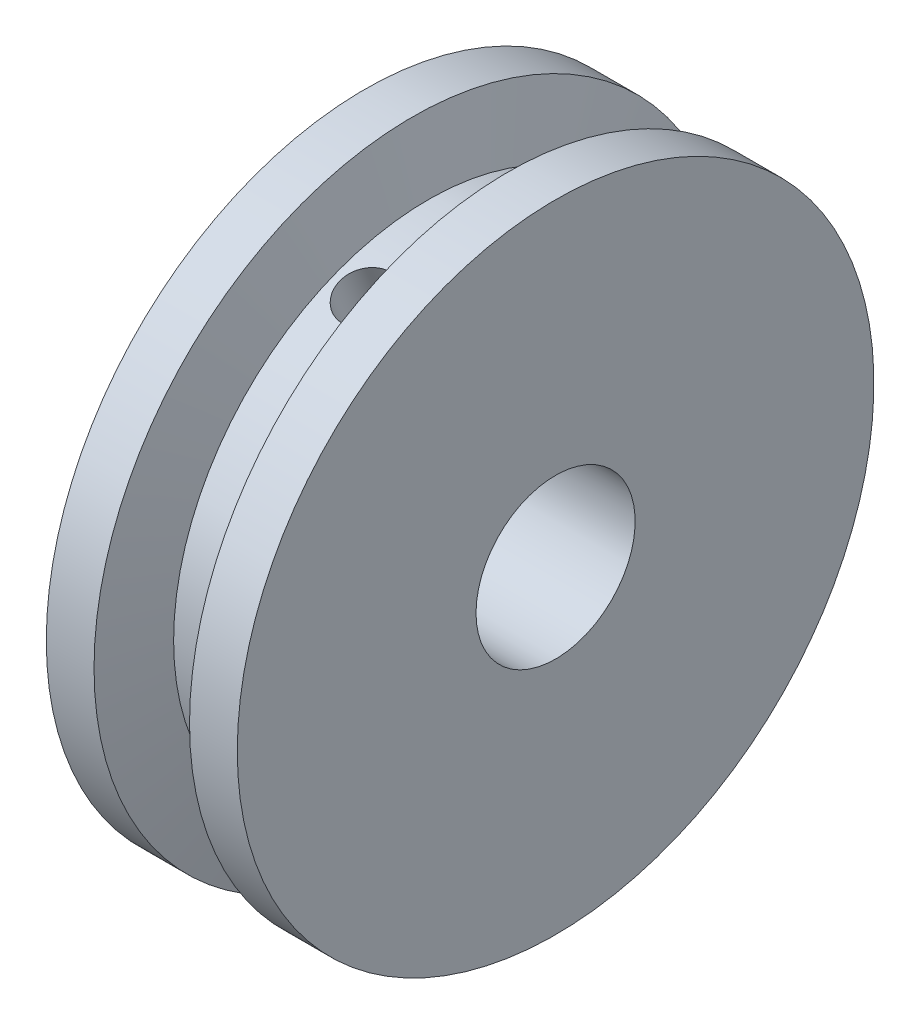
ISO-10303-21;
HEADER;
FILE_DESCRIPTION(('STEP AP214'),'2;1');
FILE_NAME('part.step','',(''),(''),'','','');
FILE_SCHEMA(('AUTOMOTIVE_DESIGN { 1 0 10303 214 1 1 1 1 }'));
ENDSEC;
DATA;
#1=APPLICATION_CONTEXT('core data for automotive mechanical design processes');
#2=APPLICATION_PROTOCOL_DEFINITION('international standard','automotive_design',2000,#1);
#3=PRODUCT_CONTEXT('',#1,'mechanical');
#4=PRODUCT('Part','Part','',(#3));
#5=PRODUCT_RELATED_PRODUCT_CATEGORY('part','',(#4));
#6=PRODUCT_DEFINITION_FORMATION('','',#4);
#7=PRODUCT_DEFINITION_CONTEXT('part definition',#1,'design');
#8=PRODUCT_DEFINITION('design','',#6,#7);
#9=PRODUCT_DEFINITION_SHAPE('','',#8);
#10=(LENGTH_UNIT() NAMED_UNIT(*) SI_UNIT(.MILLI.,.METRE.));
#11=(NAMED_UNIT(*) PLANE_ANGLE_UNIT() SI_UNIT($,.RADIAN.));
#12=(NAMED_UNIT(*) SI_UNIT($,.STERADIAN.) SOLID_ANGLE_UNIT());
#13=UNCERTAINTY_MEASURE_WITH_UNIT(LENGTH_MEASURE(1.E-05),#10,'distance_accuracy_value','');
#14=(GEOMETRIC_REPRESENTATION_CONTEXT(3) GLOBAL_UNCERTAINTY_ASSIGNED_CONTEXT((#13)) GLOBAL_UNIT_ASSIGNED_CONTEXT((#10,
#11,#12)) REPRESENTATION_CONTEXT('',''));
#15=CARTESIAN_POINT('',(0.,0.,0.));
#16=DIRECTION('',(0.,0.,1.));
#17=DIRECTION('',(1.,0.,0.));
#18=AXIS2_PLACEMENT_3D('',#15,#16,#17);
#19=CARTESIAN_POINT('',(-6.,5.74096746363637,0.));
#20=DIRECTION('',(1.,0.,0.));
#21=DIRECTION('',(0.,0.,-1.));
#22=AXIS2_PLACEMENT_3D('',#19,#20,#21);
#23=PLANE('',#22);
#24=CARTESIAN_POINT('',(-6.,-14.2590325363636,0.));
#25=DIRECTION('',(-1.,0.,0.));
#26=DIRECTION('',(0.,0.,1.));
#27=AXIS2_PLACEMENT_3D('',#24,#25,#26);
#28=CIRCLE('',#27,5.);
#29=CARTESIAN_POINT('',(-6.,-14.2590325363636,5.));
#30=VERTEX_POINT('',#29);
#31=EDGE_CURVE('E69',#30,#30,#28,.T.);
#32=ORIENTED_EDGE('',*,*,#31,.F.);
#33=EDGE_LOOP('',(#32));
#34=FACE_BOUND('',#33,.T.);
#35=CARTESIAN_POINT('',(-6.,-14.2590325363636,0.));
#36=DIRECTION('',(-1.,0.,0.));
#37=DIRECTION('',(0.,0.,1.));
#38=AXIS2_PLACEMENT_3D('',#35,#36,#37);
#39=CIRCLE('',#38,20.);
#40=CARTESIAN_POINT('',(-6.,-14.2590325363636,20.));
#41=VERTEX_POINT('',#40);
#42=EDGE_CURVE('E44',#41,#41,#39,.T.);
#43=ORIENTED_EDGE('',*,*,#42,.T.);
#44=EDGE_LOOP('',(#43));
#45=FACE_BOUND('',#44,.T.);
#46=ADVANCED_FACE('F34',(#34,#45),#23,.F.);
#47=CARTESIAN_POINT('',(-24.2895145671609,-14.2590325363636,0.));
#48=DIRECTION('',(-1.,0.,0.));
#49=DIRECTION('',(0.,0.,1.));
#50=AXIS2_PLACEMENT_3D('',#47,#48,#49);
#51=CYLINDRICAL_SURFACE('',#50,20.);
#52=ORIENTED_EDGE('',*,*,#42,.F.);
#53=EDGE_LOOP('',(#52));
#54=FACE_BOUND('',#53,.T.);
#55=CARTESIAN_POINT('',(-3.,-14.2590325363636,0.));
#56=DIRECTION('',(-1.,0.,0.));
#57=DIRECTION('',(0.,0.,1.));
#58=AXIS2_PLACEMENT_3D('',#55,#56,#57);
#59=CIRCLE('',#58,20.);
#60=CARTESIAN_POINT('',(-3.,-14.2590325363636,20.));
#61=VERTEX_POINT('',#60);
#62=EDGE_CURVE('E48',#61,#61,#59,.T.);
#63=ORIENTED_EDGE('',*,*,#62,.T.);
#64=EDGE_LOOP('',(#63));
#65=FACE_BOUND('',#64,.T.);
#66=ADVANCED_FACE('F92',(#54,#65),#51,.T.);
#67=CARTESIAN_POINT('',(-2.,-14.2590325363636,0.));
#68=DIRECTION('',(-1.,0.,0.));
#69=DIRECTION('',(0.,0.,1.));
#70=AXIS2_PLACEMENT_3D('',#67,#68,#69);
#71=CONICAL_SURFACE('',#70,16.,1.32581766366803);
#72=ORIENTED_EDGE('',*,*,#62,.F.);
#73=EDGE_LOOP('',(#72));
#74=FACE_BOUND('',#73,.T.);
#75=CARTESIAN_POINT('',(-2.,-14.2590325363636,0.));
#76=DIRECTION('',(-1.,0.,0.));
#77=DIRECTION('',(0.,0.,1.));
#78=AXIS2_PLACEMENT_3D('',#75,#76,#77);
#79=CIRCLE('',#78,16.);
#80=CARTESIAN_POINT('',(-2.,-14.2590325363636,16.));
#81=VERTEX_POINT('',#80);
#82=EDGE_CURVE('E52',#81,#81,#79,.T.);
#83=ORIENTED_EDGE('',*,*,#82,.T.);
#84=EDGE_LOOP('',(#83));
#85=FACE_BOUND('',#84,.T.);
#86=ADVANCED_FACE('F97',(#74,#85),#71,.T.);
#87=CARTESIAN_POINT('',(-24.2895145671609,-14.2590325363636,0.));
#88=DIRECTION('',(-1.,0.,0.));
#89=DIRECTION('',(0.,0.,1.));
#90=AXIS2_PLACEMENT_3D('',#87,#88,#89);
#91=CYLINDRICAL_SURFACE('',#90,16.);
#92=CARTESIAN_POINT('',(0.112968309193007,-0.145561609668122,7.53723678819504));
#93=CARTESIAN_POINT('',(0.0205518535415319,-0.145559068231829,7.53723350949665));
#94=CARTESIAN_POINT('',(-0.0719253311153655,-0.141866476878859,7.53033025097685));
#95=CARTESIAN_POINT('',(-0.25431464428269,-0.127254317295673,7.50287124472542));
#96=CARTESIAN_POINT('',(-0.344223849836857,-0.11632683124865,7.48230053935114));
#97=CARTESIAN_POINT('',(-0.518809586540177,-0.0877519112776121,7.42803742126934));
#98=CARTESIAN_POINT('',(-0.603489295750778,-0.0701086063312701,7.39435307072182));
#99=CARTESIAN_POINT('',(-0.765275494765252,-0.028892772966863,7.3147195986779));
#100=CARTESIAN_POINT('',(-0.842383460883551,-0.00532140358842814,7.26877287458133));
#101=CARTESIAN_POINT('',(-0.987152826625956,0.0468304281512649,7.16558638911541));
#102=CARTESIAN_POINT('',(-1.05478089263204,0.07542780640204,7.10830840597566));
#103=CARTESIAN_POINT('',(-1.17838360162462,0.136397097363451,6.98400942839225));
#104=CARTESIAN_POINT('',(-1.23435770630739,0.168769184322528,6.91698798413478));
#105=CARTESIAN_POINT('',(-1.33317937895686,0.236093311392244,6.77477088238849));
#106=CARTESIAN_POINT('',(-1.37599735867073,0.271050950683508,6.69955730748668));
#107=CARTESIAN_POINT('',(-1.44710202121632,0.342182679237759,6.54307973727256));
#108=CARTESIAN_POINT('',(-1.47538907906339,0.378356737081632,6.461815898168));
#109=CARTESIAN_POINT('',(-1.51653092947151,0.450539684427988,6.29576424819312));
#110=CARTESIAN_POINT('',(-1.52944056022303,0.486548701899837,6.21099008204063));
#111=CARTESIAN_POINT('',(-1.53963080947962,0.55739848866408,6.04002746529667));
#112=CARTESIAN_POINT('',(-1.53691185695116,0.592239289994755,5.95383905358753));
#113=CARTESIAN_POINT('',(-1.51596657234881,0.659649133728099,5.78284995640973));
#114=CARTESIAN_POINT('',(-1.49779920900549,0.692226305897914,5.6980452420747));
#115=CARTESIAN_POINT('',(-1.44656470859894,0.754476868156829,5.53194424669181));
#116=CARTESIAN_POINT('',(-1.41349736750771,0.784150218476616,5.45064801370291));
#117=CARTESIAN_POINT('',(-1.33333713653165,0.840061917567091,5.29379821321813));
#118=CARTESIAN_POINT('',(-1.2862182172953,0.866293760236592,5.2182556327842));
#119=CARTESIAN_POINT('',(-1.17931126720948,0.914854341597349,5.07531911104032));
#120=CARTESIAN_POINT('',(-1.1195228410534,0.937182958462734,5.00792542409049));
#121=CARTESIAN_POINT('',(-0.98864256306585,0.977779758613138,4.88302092750267));
#122=CARTESIAN_POINT('',(-0.917499402911564,0.996028562128745,4.82555756974599));
#123=CARTESIAN_POINT('',(-0.766106855811007,1.02819310620386,4.72267371330727));
#124=CARTESIAN_POINT('',(-0.685857454241717,1.04210883980509,4.67725323396436));
#125=CARTESIAN_POINT('',(-0.518490311119026,1.06554702496577,4.59988086350573));
#126=CARTESIAN_POINT('',(-0.431370984517459,1.07506845916733,4.56793209147579));
#127=CARTESIAN_POINT('',(-0.252756933566807,1.08969181375517,4.51855396322392));
#128=CARTESIAN_POINT('',(-0.161262351273868,1.09479387752725,4.50112413593774));
#129=CARTESIAN_POINT('',(0.0230547297254111,1.100561851296,4.4814023822909));
#130=CARTESIAN_POINT('',(0.115869190446933,1.10124804657818,4.47904123497395));
#131=CARTESIAN_POINT('',(0.300586562233192,1.09823814907038,4.48935015316863));
#132=CARTESIAN_POINT('',(0.392489486392356,1.09454211932427,4.50202000244036));
#133=CARTESIAN_POINT('',(0.572565177039403,1.08278289558658,4.54192976481588));
#134=CARTESIAN_POINT('',(0.660745846846731,1.07472951434396,4.56913693817964));
#135=CARTESIAN_POINT('',(0.831119749395945,1.05427505474403,4.63722620805097));
#136=CARTESIAN_POINT('',(0.913312836510138,1.04187387068373,4.67810863702773));
#137=CARTESIAN_POINT('',(1.06970520770507,1.0127159492053,4.77243488079652));
#138=CARTESIAN_POINT('',(1.14387448243546,0.995943609830261,4.82592362448569));
#139=CARTESIAN_POINT('',(1.28180930793979,0.958173322264363,4.94372958688449));
#140=CARTESIAN_POINT('',(1.34557458458423,0.937175262764757,5.00804709082478));
#141=CARTESIAN_POINT('',(1.46113932464353,0.891074583318936,5.14582758084132));
#142=CARTESIAN_POINT('',(1.51289193873064,0.865956524043532,5.21932470962547));
#143=CARTESIAN_POINT('',(1.60263970119211,0.812028845703938,5.3730564050552));
#144=CARTESIAN_POINT('',(1.64063504842917,0.783219280009007,5.45329087429116));
#145=CARTESIAN_POINT('',(1.7017105743425,0.722499429357018,5.6179514886186));
#146=CARTESIAN_POINT('',(1.72481891084244,0.690595130242929,5.70236939322261));
#147=CARTESIAN_POINT('',(1.75555631982683,0.624368140953718,5.87305370190918));
#148=CARTESIAN_POINT('',(1.76318585692532,0.590045523399217,5.95932005043003));
#149=CARTESIAN_POINT('',(1.76274232064799,0.520067938259847,6.13080140931853));
#150=CARTESIAN_POINT('',(1.75474191982625,0.484419889270978,6.21601944024129));
#151=CARTESIAN_POINT('',(1.72341817204669,0.41271987016398,6.38341406616322));
#152=CARTESIAN_POINT('',(1.70009481520622,0.376667899785354,6.46559065920077));
#153=CARTESIAN_POINT('',(1.63880767023627,0.305366250014375,6.62464254699801));
#154=CARTESIAN_POINT('',(1.60084616641208,0.270116446351147,6.70151866669931));
#155=CARTESIAN_POINT('',(1.51136801303101,0.201678139286264,6.84794763246491));
#156=CARTESIAN_POINT('',(1.45985141511913,0.168489628031666,6.91750050642942));
#157=CARTESIAN_POINT('',(1.34445324567139,0.105298285896461,7.04778508975062));
#158=CARTESIAN_POINT('',(1.28051754523273,0.0753103250390106,7.10847606854158));
#159=CARTESIAN_POINT('',(1.14220379185975,0.0199014692526676,7.21913318552632));
#160=CARTESIAN_POINT('',(1.0678232409156,-0.00551832982093405,7.26909675088162));
#161=CARTESIAN_POINT('',(0.91051088936628,-0.0507600073112511,7.35713638955805));
#162=CARTESIAN_POINT('',(0.827556652052046,-0.0705666630285627,7.39518016563252));
#163=CARTESIAN_POINT('',(0.655665696227961,-0.103588659152114,7.45819588485051));
#164=CARTESIAN_POINT('',(0.56673582609769,-0.116811403620899,7.48318251323042));
#165=CARTESIAN_POINT('',(0.416583942274798,-0.132779481958952,7.51326467420303));
#166=CARTESIAN_POINT('',(0.35632055521419,-0.13756292124429,7.52224319346543));
#167=CARTESIAN_POINT('',(0.2350363792227,-0.143954817287313,7.53423031981174));
#168=CARTESIAN_POINT('',(0.174015593731283,-0.145563288457721,7.53723895399585));
#169=CARTESIAN_POINT('',(0.112968309193007,-0.145561609668122,7.53723678819504));
#170=B_SPLINE_CURVE_WITH_KNOTS('',3,(#92,#93,#94,#95,#96,#97,#98,#99,#100,#101,#102,#103,#104,
#105,#106,#107,#108,#109,#110,#111,#112,#113,#114,#115,#116,#117,#118,#119,#120,#121,#122,#123,
#124,#125,#126,#127,#128,#129,#130,#131,#132,#133,#134,#135,#136,#137,#138,#139,#140,#141,#142,
#143,#144,#145,#146,#147,#148,#149,#150,#151,#152,#153,#154,#155,#156,#157,#158,#159,#160,#161,
#162,#163,#164,#165,#166,#167,#168,#169),.UNSPECIFIED.,.T.,.F.,(4,2,2,2,2,2,2,2,2,2,2,2,2,2,2,2,
2,2,2,2,2,2,2,2,2,2,2,2,2,2,2,2,2,2,2,2,2,2,4),(0.,0.277026424212356,0.554356526401624,
0.831516396918815,1.10862211993513,1.38667900246051,1.66474872575789,1.94343932871641,
2.22212273884121,2.49980931838174,2.77748827613979,3.05411202834668,3.33073956852619,
3.60788275479593,3.88503458960055,4.16347621632117,4.44191829017633,4.72042479598896,
4.99892226536187,5.27613947517468,5.55335269691556,5.82994421763749,6.10654246326806,
6.38414182361553,6.66174849710288,6.94042029643825,7.2190880673831,7.49722719652357,
7.77535797687329,8.0521986449277,8.3290394915325,8.60583715417001,8.88263376222162,
9.1606650195741,9.43876288500742,9.71760788090354,9.99613858410796,10.1791339997544,
10.3621285846938),.UNSPECIFIED.);
#171=CARTESIAN_POINT('',(0.112968309193007,-0.145561609668122,7.53723678819504));
#172=VERTEX_POINT('',#171);
#173=EDGE_CURVE('E10',#172,#172,#170,.T.);
#174=ORIENTED_EDGE('',*,*,#173,.T.);
#175=EDGE_LOOP('',(#174));
#176=FACE_BOUND('',#175,.T.);
#177=ORIENTED_EDGE('',*,*,#82,.F.);
#178=EDGE_LOOP('',(#177));
#179=FACE_BOUND('',#178,.T.);
#180=CARTESIAN_POINT('',(2.,-14.2590325363636,0.));
#181=DIRECTION('',(-1.,0.,0.));
#182=DIRECTION('',(0.,0.,1.));
#183=AXIS2_PLACEMENT_3D('',#180,#181,#182);
#184=CIRCLE('',#183,16.);
#185=CARTESIAN_POINT('',(2.,-14.2590325363636,16.));
#186=VERTEX_POINT('',#185);
#187=EDGE_CURVE('E57',#186,#186,#184,.T.);
#188=ORIENTED_EDGE('',*,*,#187,.T.);
#189=EDGE_LOOP('',(#188));
#190=FACE_BOUND('',#189,.T.);
#191=ADVANCED_FACE('F104',(#176,#179,#190),#91,.T.);
#192=CARTESIAN_POINT('',(3.,-14.2590325363636,0.));
#193=DIRECTION('',(1.,0.,0.));
#194=DIRECTION('',(0.,0.,-1.));
#195=AXIS2_PLACEMENT_3D('',#192,#193,#194);
#196=CONICAL_SURFACE('',#195,20.,1.32581766366803);
#197=ORIENTED_EDGE('',*,*,#187,.F.);
#198=EDGE_LOOP('',(#197));
#199=FACE_BOUND('',#198,.T.);
#200=CARTESIAN_POINT('',(3.,-14.2590325363636,0.));
#201=DIRECTION('',(-1.,0.,0.));
#202=DIRECTION('',(0.,0.,1.));
#203=AXIS2_PLACEMENT_3D('',#200,#201,#202);
#204=CIRCLE('',#203,20.);
#205=CARTESIAN_POINT('',(3.,-14.2590325363636,20.));
#206=VERTEX_POINT('',#205);
#207=EDGE_CURVE('E60',#206,#206,#204,.T.);
#208=ORIENTED_EDGE('',*,*,#207,.T.);
#209=EDGE_LOOP('',(#208));
#210=FACE_BOUND('',#209,.T.);
#211=ADVANCED_FACE('F111',(#199,#210),#196,.T.);
#212=CARTESIAN_POINT('',(-24.2895145671609,-14.2590325363636,0.));
#213=DIRECTION('',(-1.,0.,0.));
#214=DIRECTION('',(0.,0.,1.));
#215=AXIS2_PLACEMENT_3D('',#212,#213,#214);
#216=CYLINDRICAL_SURFACE('',#215,20.);
#217=ORIENTED_EDGE('',*,*,#207,.F.);
#218=EDGE_LOOP('',(#217));
#219=FACE_BOUND('',#218,.T.);
#220=CARTESIAN_POINT('',(6.,-14.2590325363636,0.));
#221=DIRECTION('',(-1.,0.,0.));
#222=DIRECTION('',(0.,0.,1.));
#223=AXIS2_PLACEMENT_3D('',#220,#221,#222);
#224=CIRCLE('',#223,20.);
#225=CARTESIAN_POINT('',(6.,-14.2590325363636,20.));
#226=VERTEX_POINT('',#225);
#227=EDGE_CURVE('E63',#226,#226,#224,.T.);
#228=ORIENTED_EDGE('',*,*,#227,.T.);
#229=EDGE_LOOP('',(#228));
#230=FACE_BOUND('',#229,.T.);
#231=ADVANCED_FACE('F114',(#219,#230),#216,.T.);
#232=CARTESIAN_POINT('',(6.,5.74096746363637,0.));
#233=DIRECTION('',(-1.,0.,0.));
#234=DIRECTION('',(0.,0.,1.));
#235=AXIS2_PLACEMENT_3D('',#232,#233,#234);
#236=PLANE('',#235);
#237=ORIENTED_EDGE('',*,*,#227,.F.);
#238=EDGE_LOOP('',(#237));
#239=FACE_BOUND('',#238,.T.);
#240=CARTESIAN_POINT('',(6.,-14.2590325363636,0.));
#241=DIRECTION('',(-1.,0.,0.));
#242=DIRECTION('',(0.,0.,1.));
#243=AXIS2_PLACEMENT_3D('',#240,#241,#242);
#244=CIRCLE('',#243,5.);
#245=CARTESIAN_POINT('',(6.,-14.2590325363636,5.));
#246=VERTEX_POINT('',#245);
#247=EDGE_CURVE('E66',#246,#246,#244,.T.);
#248=ORIENTED_EDGE('',*,*,#247,.T.);
#249=EDGE_LOOP('',(#248));
#250=FACE_BOUND('',#249,.T.);
#251=ADVANCED_FACE('F88',(#239,#250),#236,.F.);
#252=CARTESIAN_POINT('',(-24.2895145671609,-14.2590325363636,0.));
#253=DIRECTION('',(-1.,0.,0.));
#254=DIRECTION('',(0.,0.,1.));
#255=AXIS2_PLACEMENT_3D('',#252,#253,#254);
#256=CYLINDRICAL_SURFACE('',#255,5.);
#257=CARTESIAN_POINT('',(0.112968309193007,-10.5115879380031,3.31008443732465));
#258=CARTESIAN_POINT('',(0.202897708483633,-10.5115881586011,3.31008461044848));
#259=CARTESIAN_POINT('',(0.2928259956927,-10.5063964872385,3.30423470458274));
#260=CARTESIAN_POINT('',(0.470021982628183,-10.4860487720068,3.28097952282783));
#261=CARTESIAN_POINT('',(0.557289196653402,-10.470890920359,3.26357215050894));
#262=CARTESIAN_POINT('',(0.726568008572081,-10.4317970691317,3.21763390367706));
#263=CARTESIAN_POINT('',(0.808589386856539,-10.4078779997854,3.18912447618119));
#264=CARTESIAN_POINT('',(0.96554980555011,-10.3528729854166,3.1215076748971));
#265=CARTESIAN_POINT('',(1.0404873276567,-10.321785508858,3.08239803605141));
#266=CARTESIAN_POINT('',(1.18402594858125,-10.2531184924708,2.99264891051272));
#267=CARTESIAN_POINT('',(1.25231579492654,-10.2153506797886,2.94165555408963));
#268=CARTESIAN_POINT('',(1.3778275768719,-10.1362622427635,2.82974456001498));
#269=CARTESIAN_POINT('',(1.43504777465901,-10.0949410620494,2.7688253668773));
#270=CARTESIAN_POINT('',(1.53820189821583,-10.0098171098574,2.63638234543572));
#271=CARTESIAN_POINT('',(1.5838106155997,-9.96597792162566,2.56462760555376));
#272=CARTESIAN_POINT('',(1.66029704404277,-9.87908251949558,2.41322239916702));
#273=CARTESIAN_POINT('',(1.69117864124955,-9.83602610192984,2.33357402231885));
#274=CARTESIAN_POINT('',(1.73628138106816,-9.75418181443253,2.17124303053664));
#275=CARTESIAN_POINT('',(1.75103552418155,-9.71529838141577,2.08875695796681));
#276=CARTESIAN_POINT('',(1.76515830790782,-9.64173244267772,1.9206633866155));
#277=CARTESIAN_POINT('',(1.76453083703909,-9.60704887744525,1.83505668220335));
#278=CARTESIAN_POINT('',(1.74824833464986,-9.5441715697353,1.66669051209708));
#279=CARTESIAN_POINT('',(1.73317204425581,-9.51577956888781,1.58394813217305));
#280=CARTESIAN_POINT('',(1.68937570600731,-9.46428176053235,1.42046272423088));
#281=CARTESIAN_POINT('',(1.66065473836875,-9.44117630954493,1.33971983138376));
#282=CARTESIAN_POINT('',(1.59004093112878,-9.39994430616371,1.18153923063046));
#283=CARTESIAN_POINT('',(1.54798162493559,-9.38188642293865,1.10415817313233));
#284=CARTESIAN_POINT('',(1.45202163415435,-9.35069740633638,0.956025517566799));
#285=CARTESIAN_POINT('',(1.3981177034697,-9.33756762621451,0.885275744443438));
#286=CARTESIAN_POINT('',(1.27707313272584,-9.31500148901393,0.749349471266486));
#287=CARTESIAN_POINT('',(1.20943600345865,-9.30576379752696,0.684581479222648));
#288=CARTESIAN_POINT('',(1.06434171955744,-9.29088825961963,0.566643431443611));
#289=CARTESIAN_POINT('',(0.986883116151859,-9.28525094503517,0.513475089934217));
#290=CARTESIAN_POINT('',(0.822933910335448,-9.27648714886049,0.420095343456465));
#291=CARTESIAN_POINT('',(0.736333921531634,-9.27339619560433,0.380071816285635));
#292=CARTESIAN_POINT('',(0.557420702035499,-9.26891228493542,0.315830789643623));
#293=CARTESIAN_POINT('',(0.465109825734737,-9.26751863262463,0.291606823505657));
#294=CARTESIAN_POINT('',(0.281778141493757,-9.26582153301216,0.260904598674664));
#295=CARTESIAN_POINT('',(0.190881464843812,-9.26547250752023,0.25368746790348));
#296=CARTESIAN_POINT('',(0.0092304613050738,-9.26554898065349,0.255194089735878));
#297=CARTESIAN_POINT('',(-0.0815238879361837,-9.26597434216893,0.263915020413148));
#298=CARTESIAN_POINT('',(-0.257151763043664,-9.26779426547452,0.296285866581575));
#299=CARTESIAN_POINT('',(-0.342120460203751,-9.26915594750354,0.319426897291922));
#300=CARTESIAN_POINT('',(-0.50715429782373,-9.27333880957523,0.379140841017097));
#301=CARTESIAN_POINT('',(-0.587218577133094,-9.27616024511432,0.415716105061639));
#302=CARTESIAN_POINT('',(-0.742941717847803,-9.28412390958647,0.502216636490901));
#303=CARTESIAN_POINT('',(-0.81838485983261,-9.2893358766267,0.552523211551699));
#304=CARTESIAN_POINT('',(-0.960307294553658,-9.30301964707763,0.664148455588425));
#305=CARTESIAN_POINT('',(-1.02678398613386,-9.31149239370138,0.725470308103976));
#306=CARTESIAN_POINT('',(-1.15211487159047,-9.33311060985237,0.860327841352151));
#307=CARTESIAN_POINT('',(-1.21046392973352,-9.34645698981356,0.934302126605237));
#308=CARTESIAN_POINT('',(-1.31402433239808,-9.37861656317354,1.08988094209563));
#309=CARTESIAN_POINT('',(-1.35923616985944,-9.39742955139915,1.1714851858868));
#310=CARTESIAN_POINT('',(-1.43482068306578,-9.44093158047835,1.33915857171942));
#311=CARTESIAN_POINT('',(-1.46529214955052,-9.46557980502328,1.42519358885622));
#312=CARTESIAN_POINT('',(-1.51071838399926,-9.52086354901033,1.59940347903876));
#313=CARTESIAN_POINT('',(-1.52567862927223,-9.5514969504277,1.68757758546752));
#314=CARTESIAN_POINT('',(-1.53917250866386,-9.61663427513005,1.85907650468237));
#315=CARTESIAN_POINT('',(-1.53843200289617,-9.65089449273392,1.94243739698431));
#316=CARTESIAN_POINT('',(-1.52233016653335,-9.72330596062879,2.10598696603846));
#317=CARTESIAN_POINT('',(-1.50696998251728,-9.7614569055718,2.1861758910452));
#318=CARTESIAN_POINT('',(-1.46254338488275,-9.83958581793203,2.34004923810549));
#319=CARTESIAN_POINT('',(-1.43369035588782,-9.87952688348117,2.41381443152658));
#320=CARTESIAN_POINT('',(-1.36329379602559,-9.96011697749466,2.55458624425341));
#321=CARTESIAN_POINT('',(-1.32174798568754,-10.0007661318857,2.62159164670453));
#322=CARTESIAN_POINT('',(-1.22539903688193,-10.0824439736574,2.74992856956939));
#323=CARTESIAN_POINT('',(-1.17016754271005,-10.1234324065622,2.81096391891615));
#324=CARTESIAN_POINT('',(-1.04874804016289,-10.2021944571383,2.92348951598064));
#325=CARTESIAN_POINT('',(-0.982556571509212,-10.239967053786,2.97497673824946));
#326=CARTESIAN_POINT('',(-0.838075839352353,-10.3115693392649,3.06939470918088));
#327=CARTESIAN_POINT('',(-0.75942142131783,-10.3451936696061,3.111924163198));
#328=CARTESIAN_POINT('',(-0.594010028682813,-10.4045080832387,3.18510143081071));
#329=CARTESIAN_POINT('',(-0.507255377972048,-10.4302004330959,3.21575263925854));
#330=CARTESIAN_POINT('',(-0.332688418363761,-10.4706446442486,3.26328754239702));
#331=CARTESIAN_POINT('',(-0.245163648871782,-10.4858942586957,3.2808021172351));
#332=CARTESIAN_POINT('',(-0.0674355195143038,-10.5063641544126,3.30419857507197));
#333=CARTESIAN_POINT('',(0.0227669542482641,-10.5115877167381,3.31008426367727));
#334=CARTESIAN_POINT('',(0.112968309193007,-10.5115879380031,3.31008443732465));
#335=B_SPLINE_CURVE_WITH_KNOTS('',3,(#257,#258,#259,#260,#261,#262,#263,#264,#265,#266,#267,
#268,#269,#270,#271,#272,#273,#274,#275,#276,#277,#278,#279,#280,#281,#282,#283,#284,#285,#286,
#287,#288,#289,#290,#291,#292,#293,#294,#295,#296,#297,#298,#299,#300,#301,#302,#303,#304,#305,
#306,#307,#308,#309,#310,#311,#312,#313,#314,#315,#316,#317,#318,#319,#320,#321,#322,#323,#324,
#325,#326,#327,#328,#329,#330,#331,#332,#333,#334),.UNSPECIFIED.,.T.,.F.,(4,2,2,2,2,2,2,2,2,2,2,
2,2,2,2,2,2,2,2,2,2,2,2,2,2,2,2,2,2,2,2,2,2,2,2,2,2,2,4),(0.,0.269454302916434,
0.538957495994024,0.807942623457629,1.07698527314817,1.35539043483169,1.63383926765626,
1.91939248597707,2.2048703116341,2.48059787689522,2.75625573811558,3.02131448573183,
3.28639110342469,3.55491555402299,3.82351368748603,4.10452131305698,4.38557043856028,
4.67047751353534,4.95526790443248,5.22743703243198,5.49955797597572,5.76258081799806,
6.02564971172706,6.29693565916083,6.56830013781584,6.85241935986188,7.1365279197002,
7.4187050399578,7.70078248410446,7.96984890311454,8.23889422176275,8.50382155957888,
8.76879650315114,9.04343817678384,9.31816672608183,9.60337461850676,9.88850093710113,
10.1588585876967,10.4291277478431),.UNSPECIFIED.);
#336=CARTESIAN_POINT('',(0.112968309193007,-10.5115879380031,3.31008443732465));
#337=VERTEX_POINT('',#336);
#338=EDGE_CURVE('E72',#337,#337,#335,.T.);
#339=ORIENTED_EDGE('',*,*,#338,.T.);
#340=EDGE_LOOP('',(#339));
#341=FACE_BOUND('',#340,.T.);
#342=ORIENTED_EDGE('',*,*,#247,.F.);
#343=EDGE_LOOP('',(#342));
#344=FACE_BOUND('',#343,.T.);
#345=ORIENTED_EDGE('',*,*,#31,.T.);
#346=EDGE_LOOP('',(#345));
#347=FACE_BOUND('',#346,.T.);
#348=ADVANCED_FACE('F77',(#341,#344,#347),#256,.F.);
#349=CARTESIAN_POINT('',(0.112968309193007,0.556468612232665,6.041599599108));
#350=DIRECTION('',(0.,0.925968821787268,0.37759997494425));
#351=DIRECTION('',(0.,-0.37759997494425,0.925968821787268));
#352=AXIS2_PLACEMENT_3D('',#349,#350,#351);
#353=CYLINDRICAL_SURFACE('',#352,1.65);
#354=ORIENTED_EDGE('',*,*,#173,.F.);
#355=EDGE_LOOP('',(#354));
#356=FACE_BOUND('',#355,.T.);
#357=ORIENTED_EDGE('',*,*,#338,.F.);
#358=EDGE_LOOP('',(#357));
#359=FACE_BOUND('',#358,.T.);
#360=ADVANCED_FACE('F80',(#356,#359),#353,.F.);
#361=CLOSED_SHELL('',(#46,#66,#86,#191,#211,#231,#251,#348,#360));
#362=MANIFOLD_SOLID_BREP('B2',#361);
#363=ADVANCED_BREP_SHAPE_REPRESENTATION('',(#18,#362),#14);
#364=SHAPE_DEFINITION_REPRESENTATION(#9,#363);
ENDSEC;
END-ISO-10303-21;
